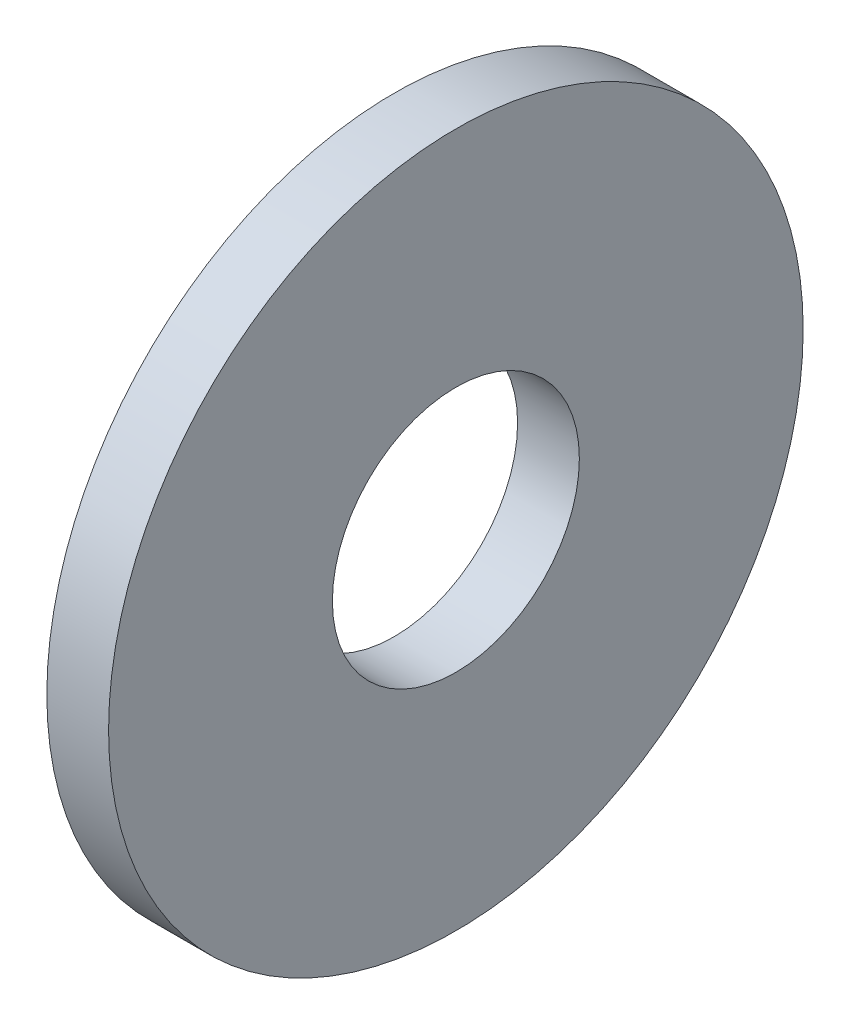
ISO-10303-21;
HEADER;
FILE_DESCRIPTION(('STEP AP214'),'2;1');
FILE_NAME('part.step','',(''),(''),'','','');
FILE_SCHEMA(('AUTOMOTIVE_DESIGN { 1 0 10303 214 1 1 1 1 }'));
ENDSEC;
DATA;
#1=APPLICATION_CONTEXT('core data for automotive mechanical design processes');
#2=APPLICATION_PROTOCOL_DEFINITION('international standard','automotive_design',2000,#1);
#3=PRODUCT_CONTEXT('',#1,'mechanical');
#4=PRODUCT('Part','Part','',(#3));
#5=PRODUCT_RELATED_PRODUCT_CATEGORY('part','',(#4));
#6=PRODUCT_DEFINITION_FORMATION('','',#4);
#7=PRODUCT_DEFINITION_CONTEXT('part definition',#1,'design');
#8=PRODUCT_DEFINITION('design','',#6,#7);
#9=PRODUCT_DEFINITION_SHAPE('','',#8);
#10=(LENGTH_UNIT() NAMED_UNIT(*) SI_UNIT(.MILLI.,.METRE.));
#11=(NAMED_UNIT(*) PLANE_ANGLE_UNIT() SI_UNIT($,.RADIAN.));
#12=(NAMED_UNIT(*) SI_UNIT($,.STERADIAN.) SOLID_ANGLE_UNIT());
#13=UNCERTAINTY_MEASURE_WITH_UNIT(LENGTH_MEASURE(1.E-05),#10,'distance_accuracy_value','');
#14=(GEOMETRIC_REPRESENTATION_CONTEXT(3) GLOBAL_UNCERTAINTY_ASSIGNED_CONTEXT((#13)) GLOBAL_UNIT_ASSIGNED_CONTEXT((#10,
#11,#12)) REPRESENTATION_CONTEXT('',''));
#15=CARTESIAN_POINT('',(0.,0.,0.));
#16=DIRECTION('',(0.,0.,1.));
#17=DIRECTION('',(1.,0.,0.));
#18=AXIS2_PLACEMENT_3D('',#15,#16,#17);
#19=CARTESIAN_POINT('',(-34.9249999999999,0.,0.));
#20=DIRECTION('',(-1.,0.,0.));
#21=DIRECTION('',(0.,0.,1.));
#22=AXIS2_PLACEMENT_3D('',#19,#20,#21);
#23=CYLINDRICAL_SURFACE('',#22,3.2);
#24=CARTESIAN_POINT('',(0.,0.,0.));
#25=DIRECTION('',(-1.,0.,0.));
#26=DIRECTION('',(0.,0.,1.));
#27=AXIS2_PLACEMENT_3D('',#24,#25,#26);
#28=CIRCLE('',#27,3.2);
#29=CARTESIAN_POINT('',(0.,0.,3.2));
#30=VERTEX_POINT('',#29);
#31=EDGE_CURVE('E10',#30,#30,#28,.T.);
#32=ORIENTED_EDGE('',*,*,#31,.F.);
#33=EDGE_LOOP('',(#32));
#34=FACE_BOUND('',#33,.T.);
#35=CARTESIAN_POINT('',(-1.6,0.,0.));
#36=DIRECTION('',(-1.,0.,0.));
#37=DIRECTION('',(0.,0.,1.));
#38=AXIS2_PLACEMENT_3D('',#35,#36,#37);
#39=CIRCLE('',#38,3.2);
#40=CARTESIAN_POINT('',(-1.6,0.,3.2));
#41=VERTEX_POINT('',#40);
#42=EDGE_CURVE('E42',#41,#41,#39,.T.);
#43=ORIENTED_EDGE('',*,*,#42,.T.);
#44=EDGE_LOOP('',(#43));
#45=FACE_BOUND('',#44,.T.);
#46=ADVANCED_FACE('F28',(#34,#45),#23,.F.);
#47=CARTESIAN_POINT('',(0.,3.2,0.));
#48=DIRECTION('',(-1.,0.,0.));
#49=DIRECTION('',(0.,0.,1.));
#50=AXIS2_PLACEMENT_3D('',#47,#48,#49);
#51=PLANE('',#50);
#52=CARTESIAN_POINT('',(0.,0.,0.));
#53=DIRECTION('',(-1.,0.,0.));
#54=DIRECTION('',(0.,0.,1.));
#55=AXIS2_PLACEMENT_3D('',#52,#53,#54);
#56=CIRCLE('',#55,9.);
#57=CARTESIAN_POINT('',(0.,0.,9.));
#58=VERTEX_POINT('',#57);
#59=EDGE_CURVE('E34',#58,#58,#56,.T.);
#60=ORIENTED_EDGE('',*,*,#59,.F.);
#61=EDGE_LOOP('',(#60));
#62=FACE_BOUND('',#61,.T.);
#63=ORIENTED_EDGE('',*,*,#31,.T.);
#64=EDGE_LOOP('',(#63));
#65=FACE_BOUND('',#64,.T.);
#66=ADVANCED_FACE('F57',(#62,#65),#51,.F.);
#67=CARTESIAN_POINT('',(-34.9249999999999,0.,0.));
#68=DIRECTION('',(-1.,0.,0.));
#69=DIRECTION('',(0.,0.,1.));
#70=AXIS2_PLACEMENT_3D('',#67,#68,#69);
#71=CYLINDRICAL_SURFACE('',#70,9.);
#72=CARTESIAN_POINT('',(-1.6,0.,0.));
#73=DIRECTION('',(-1.,0.,0.));
#74=DIRECTION('',(0.,0.,1.));
#75=AXIS2_PLACEMENT_3D('',#72,#73,#74);
#76=CIRCLE('',#75,9.);
#77=CARTESIAN_POINT('',(-1.6,0.,9.));
#78=VERTEX_POINT('',#77);
#79=EDGE_CURVE('E38',#78,#78,#76,.T.);
#80=ORIENTED_EDGE('',*,*,#79,.F.);
#81=EDGE_LOOP('',(#80));
#82=FACE_BOUND('',#81,.T.);
#83=ORIENTED_EDGE('',*,*,#59,.T.);
#84=EDGE_LOOP('',(#83));
#85=FACE_BOUND('',#84,.T.);
#86=ADVANCED_FACE('F52',(#82,#85),#71,.T.);
#87=CARTESIAN_POINT('',(-1.6,9.,0.));
#88=DIRECTION('',(1.,0.,0.));
#89=DIRECTION('',(0.,0.,-1.));
#90=AXIS2_PLACEMENT_3D('',#87,#88,#89);
#91=PLANE('',#90);
#92=ORIENTED_EDGE('',*,*,#42,.F.);
#93=EDGE_LOOP('',(#92));
#94=FACE_BOUND('',#93,.T.);
#95=ORIENTED_EDGE('',*,*,#79,.T.);
#96=EDGE_LOOP('',(#95));
#97=FACE_BOUND('',#96,.T.);
#98=ADVANCED_FACE('F49',(#94,#97),#91,.F.);
#99=CLOSED_SHELL('',(#46,#66,#86,#98));
#100=MANIFOLD_SOLID_BREP('B2',#99);
#101=ADVANCED_BREP_SHAPE_REPRESENTATION('',(#18,#100),#14);
#102=SHAPE_DEFINITION_REPRESENTATION(#9,#101);
ENDSEC;
END-ISO-10303-21;
